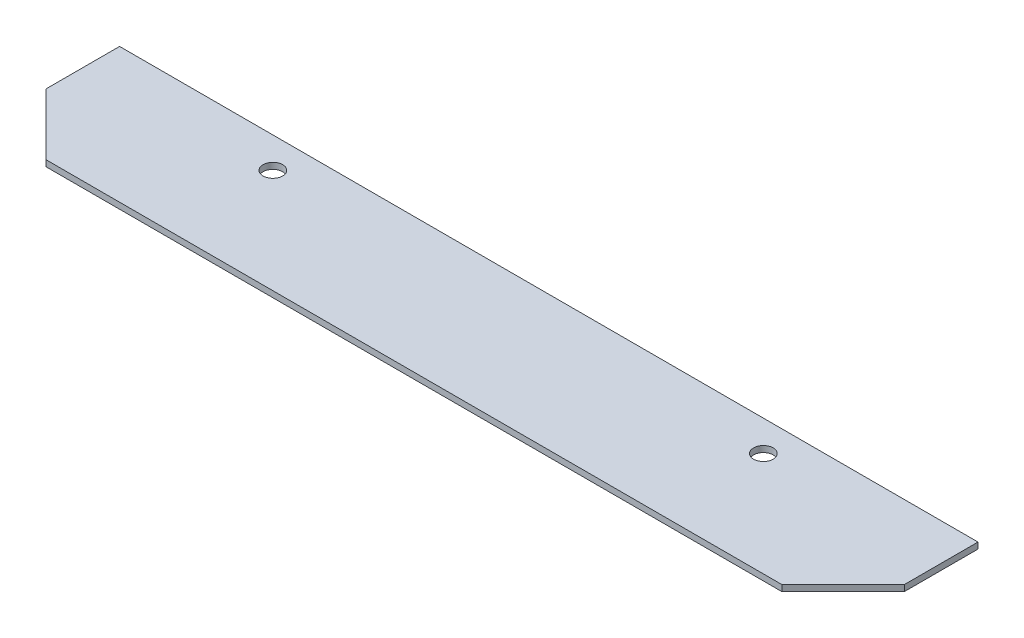
ISO-10303-21;
HEADER;
FILE_DESCRIPTION(('STEP AP214'),'2;1');
FILE_NAME('part.step','',(''),(''),'','','');
FILE_SCHEMA(('AUTOMOTIVE_DESIGN { 1 0 10303 214 1 1 1 1 }'));
ENDSEC;
DATA;
#1=APPLICATION_CONTEXT('core data for automotive mechanical design processes');
#2=APPLICATION_PROTOCOL_DEFINITION('international standard','automotive_design',2000,#1);
#3=PRODUCT_CONTEXT('',#1,'mechanical');
#4=PRODUCT('Part','Part','',(#3));
#5=PRODUCT_RELATED_PRODUCT_CATEGORY('part','',(#4));
#6=PRODUCT_DEFINITION_FORMATION('','',#4);
#7=PRODUCT_DEFINITION_CONTEXT('part definition',#1,'design');
#8=PRODUCT_DEFINITION('design','',#6,#7);
#9=PRODUCT_DEFINITION_SHAPE('','',#8);
#10=(LENGTH_UNIT() NAMED_UNIT(*) SI_UNIT(.MILLI.,.METRE.));
#11=(NAMED_UNIT(*) PLANE_ANGLE_UNIT() SI_UNIT($,.RADIAN.));
#12=(NAMED_UNIT(*) SI_UNIT($,.STERADIAN.) SOLID_ANGLE_UNIT());
#13=UNCERTAINTY_MEASURE_WITH_UNIT(LENGTH_MEASURE(1.E-05),#10,'distance_accuracy_value','');
#14=(GEOMETRIC_REPRESENTATION_CONTEXT(3) GLOBAL_UNCERTAINTY_ASSIGNED_CONTEXT((#13)) GLOBAL_UNIT_ASSIGNED_CONTEXT((#10,
#11,#12)) REPRESENTATION_CONTEXT('',''));
#15=CARTESIAN_POINT('',(0.,0.,0.));
#16=DIRECTION('',(0.,0.,1.));
#17=DIRECTION('',(1.,0.,0.));
#18=AXIS2_PLACEMENT_3D('',#15,#16,#17);
#19=CARTESIAN_POINT('',(70.,1.,-11.));
#20=DIRECTION('',(-1.,0.,0.));
#21=DIRECTION('',(0.,0.,1.));
#22=AXIS2_PLACEMENT_3D('',#19,#20,#21);
#23=PLANE('',#22);
#24=DIRECTION('',(0.,0.,-1.));
#25=VECTOR('',#24,1.);
#26=CARTESIAN_POINT('',(70.,1.,-11.));
#27=LINE('',#26,#25);
#28=CARTESIAN_POINT('',(70.,1.,1.00000000000002));
#29=VERTEX_POINT('',#28);
#30=CARTESIAN_POINT('',(70.,1.,-11.));
#31=VERTEX_POINT('',#30);
#32=EDGE_CURVE('E100',#29,#31,#27,.T.);
#33=ORIENTED_EDGE('',*,*,#32,.F.);
#34=DIRECTION('',(0.,-1.,0.));
#35=VECTOR('',#34,1.);
#36=CARTESIAN_POINT('',(70.,1.,1.00000000000002));
#37=LINE('',#36,#35);
#38=CARTESIAN_POINT('',(70.,0.,1.00000000000002));
#39=VERTEX_POINT('',#38);
#40=EDGE_CURVE('E11',#29,#39,#37,.T.);
#41=ORIENTED_EDGE('',*,*,#40,.T.);
#42=DIRECTION('',(0.,0.,-1.));
#43=VECTOR('',#42,1.);
#44=CARTESIAN_POINT('',(70.,0.,-11.));
#45=LINE('',#44,#43);
#46=CARTESIAN_POINT('',(70.,0.,-11.));
#47=VERTEX_POINT('',#46);
#48=EDGE_CURVE('E118',#39,#47,#45,.T.);
#49=ORIENTED_EDGE('',*,*,#48,.T.);
#50=DIRECTION('',(0.,-1.,0.));
#51=VECTOR('',#50,1.);
#52=CARTESIAN_POINT('',(70.,1.,-11.));
#53=LINE('',#52,#51);
#54=EDGE_CURVE('E109',#31,#47,#53,.T.);
#55=ORIENTED_EDGE('',*,*,#54,.F.);
#56=EDGE_LOOP('',(#33,#41,#49,#55));
#57=FACE_BOUND('',#56,.T.);
#58=ADVANCED_FACE('F43',(#57),#23,.F.);
#59=CARTESIAN_POINT('',(-70.,1.,-11.));
#60=DIRECTION('',(0.,0.,1.));
#61=DIRECTION('',(1.,0.,0.));
#62=AXIS2_PLACEMENT_3D('',#59,#60,#61);
#63=PLANE('',#62);
#64=DIRECTION('',(-1.,0.,0.));
#65=VECTOR('',#64,1.);
#66=CARTESIAN_POINT('',(-70.,0.,-11.));
#67=LINE('',#66,#65);
#68=CARTESIAN_POINT('',(-70.,0.,-11.));
#69=VERTEX_POINT('',#68);
#70=EDGE_CURVE('E149',#47,#69,#67,.T.);
#71=ORIENTED_EDGE('',*,*,#70,.T.);
#72=DIRECTION('',(0.,-1.,0.));
#73=VECTOR('',#72,1.);
#74=CARTESIAN_POINT('',(-70.,1.,-11.));
#75=LINE('',#74,#73);
#76=CARTESIAN_POINT('',(-70.,1.,-11.));
#77=VERTEX_POINT('',#76);
#78=EDGE_CURVE('E115',#77,#69,#75,.T.);
#79=ORIENTED_EDGE('',*,*,#78,.F.);
#80=DIRECTION('',(-1.,0.,0.));
#81=VECTOR('',#80,1.);
#82=CARTESIAN_POINT('',(-70.,1.,-11.));
#83=LINE('',#82,#81);
#84=EDGE_CURVE('E99',#31,#77,#83,.T.);
#85=ORIENTED_EDGE('',*,*,#84,.F.);
#86=ORIENTED_EDGE('',*,*,#54,.T.);
#87=EDGE_LOOP('',(#71,#79,#85,#86));
#88=FACE_BOUND('',#87,.T.);
#89=ADVANCED_FACE('F108',(#88),#63,.F.);
#90=CARTESIAN_POINT('',(-70.,1.,-11.));
#91=DIRECTION('',(1.,0.,0.));
#92=DIRECTION('',(0.,0.,-1.));
#93=AXIS2_PLACEMENT_3D('',#90,#91,#92);
#94=PLANE('',#93);
#95=DIRECTION('',(0.,0.,1.));
#96=VECTOR('',#95,1.);
#97=CARTESIAN_POINT('',(-70.,0.,-11.));
#98=LINE('',#97,#96);
#99=CARTESIAN_POINT('',(-70.,0.,0.999999999999949));
#100=VERTEX_POINT('',#99);
#101=EDGE_CURVE('E150',#69,#100,#98,.T.);
#102=ORIENTED_EDGE('',*,*,#101,.T.);
#103=DIRECTION('',(0.,1.,0.));
#104=VECTOR('',#103,1.);
#105=CARTESIAN_POINT('',(-70.,1.,0.999999999999949));
#106=LINE('',#105,#104);
#107=CARTESIAN_POINT('',(-70.,1.,0.999999999999949));
#108=VERTEX_POINT('',#107);
#109=EDGE_CURVE('E70',#100,#108,#106,.T.);
#110=ORIENTED_EDGE('',*,*,#109,.T.);
#111=DIRECTION('',(0.,0.,1.));
#112=VECTOR('',#111,1.);
#113=CARTESIAN_POINT('',(-70.,1.,-11.));
#114=LINE('',#113,#112);
#115=EDGE_CURVE('E114',#77,#108,#114,.T.);
#116=ORIENTED_EDGE('',*,*,#115,.F.);
#117=ORIENTED_EDGE('',*,*,#78,.T.);
#118=EDGE_LOOP('',(#102,#110,#116,#117));
#119=FACE_BOUND('',#118,.T.);
#120=ADVANCED_FACE('F146',(#119),#94,.F.);
#121=CARTESIAN_POINT('',(-70.,1.,11.));
#122=DIRECTION('',(0.,0.,-1.));
#123=DIRECTION('',(-1.,0.,0.));
#124=AXIS2_PLACEMENT_3D('',#121,#122,#123);
#125=PLANE('',#124);
#126=DIRECTION('',(1.,0.,0.));
#127=VECTOR('',#126,1.);
#128=CARTESIAN_POINT('',(-70.,1.,11.));
#129=LINE('',#128,#127);
#130=CARTESIAN_POINT('',(-60.,1.,11.));
#131=VERTEX_POINT('',#130);
#132=CARTESIAN_POINT('',(60.,1.,11.));
#133=VERTEX_POINT('',#132);
#134=EDGE_CURVE('E125',#131,#133,#129,.T.);
#135=ORIENTED_EDGE('',*,*,#134,.F.);
#136=DIRECTION('',(0.,-1.,0.));
#137=VECTOR('',#136,1.);
#138=CARTESIAN_POINT('',(-60.,1.,11.));
#139=LINE('',#138,#137);
#140=CARTESIAN_POINT('',(-60.,0.,11.));
#141=VERTEX_POINT('',#140);
#142=EDGE_CURVE('E117',#131,#141,#139,.T.);
#143=ORIENTED_EDGE('',*,*,#142,.T.);
#144=DIRECTION('',(1.,0.,0.));
#145=VECTOR('',#144,1.);
#146=CARTESIAN_POINT('',(-70.,0.,11.));
#147=LINE('',#146,#145);
#148=CARTESIAN_POINT('',(60.,0.,11.));
#149=VERTEX_POINT('',#148);
#150=EDGE_CURVE('E104',#141,#149,#147,.T.);
#151=ORIENTED_EDGE('',*,*,#150,.T.);
#152=DIRECTION('',(0.,1.,0.));
#153=VECTOR('',#152,1.);
#154=CARTESIAN_POINT('',(60.,1.,11.));
#155=LINE('',#154,#153);
#156=EDGE_CURVE('E116',#149,#133,#155,.T.);
#157=ORIENTED_EDGE('',*,*,#156,.T.);
#158=EDGE_LOOP('',(#135,#143,#151,#157));
#159=FACE_BOUND('',#158,.T.);
#160=ADVANCED_FACE('F139',(#159),#125,.F.);
#161=CARTESIAN_POINT('',(0.,1.,0.));
#162=DIRECTION('',(0.,1.,0.));
#163=DIRECTION('',(0.,0.,1.));
#164=AXIS2_PLACEMENT_3D('',#161,#162,#163);
#165=PLANE('',#164);
#166=CARTESIAN_POINT('',(40.,0.999999999999999,-5.99999999999999));
#167=DIRECTION('',(0.,1.,0.));
#168=DIRECTION('',(0.,0.,1.));
#169=AXIS2_PLACEMENT_3D('',#166,#167,#168);
#170=CIRCLE('',#169,1.6);
#171=CARTESIAN_POINT('',(40.,0.999999999999999,-4.4));
#172=VERTEX_POINT('',#171);
#173=EDGE_CURVE('E153',#172,#172,#170,.T.);
#174=ORIENTED_EDGE('',*,*,#173,.F.);
#175=EDGE_LOOP('',(#174));
#176=FACE_BOUND('',#175,.T.);
#177=CARTESIAN_POINT('',(-40.,0.999999999999999,-5.99999999999999));
#178=DIRECTION('',(0.,1.,0.));
#179=DIRECTION('',(0.,0.,1.));
#180=AXIS2_PLACEMENT_3D('',#177,#178,#179);
#181=CIRCLE('',#180,1.6);
#182=CARTESIAN_POINT('',(-40.,0.999999999999999,-4.4));
#183=VERTEX_POINT('',#182);
#184=EDGE_CURVE('E158',#183,#183,#181,.T.);
#185=ORIENTED_EDGE('',*,*,#184,.F.);
#186=EDGE_LOOP('',(#185));
#187=FACE_BOUND('',#186,.T.);
#188=ORIENTED_EDGE('',*,*,#115,.T.);
#189=DIRECTION('',(-0.707106781186546,0.,-0.70710678118655));
#190=VECTOR('',#189,1.);
#191=CARTESIAN_POINT('',(-35.5000000000002,1.,35.5));
#192=LINE('',#191,#190);
#193=EDGE_CURVE('E55',#108,#131,#192,.F.);
#194=ORIENTED_EDGE('',*,*,#193,.T.);
#195=ORIENTED_EDGE('',*,*,#134,.T.);
#196=DIRECTION('',(-0.707106781186549,0.,0.707106781186547));
#197=VECTOR('',#196,1.);
#198=CARTESIAN_POINT('',(35.4999999999999,1.,35.5));
#199=LINE('',#198,#197);
#200=EDGE_CURVE('E56',#133,#29,#199,.F.);
#201=ORIENTED_EDGE('',*,*,#200,.T.);
#202=ORIENTED_EDGE('',*,*,#32,.T.);
#203=ORIENTED_EDGE('',*,*,#84,.T.);
#204=EDGE_LOOP('',(#188,#194,#195,#201,#202,#203));
#205=FACE_BOUND('',#204,.T.);
#206=ADVANCED_FACE('F97',(#176,#187,#205),#165,.T.);
#207=CARTESIAN_POINT('',(0.,0.,0.));
#208=DIRECTION('',(0.,1.,0.));
#209=DIRECTION('',(0.,0.,1.));
#210=AXIS2_PLACEMENT_3D('',#207,#208,#209);
#211=PLANE('',#210);
#212=CARTESIAN_POINT('',(40.,0.,-5.99999999999999));
#213=DIRECTION('',(0.,-1.,0.));
#214=DIRECTION('',(0.,0.,-1.));
#215=AXIS2_PLACEMENT_3D('',#212,#213,#214);
#216=CIRCLE('',#215,1.6);
#217=CARTESIAN_POINT('',(40.,0.,-7.59999999999999));
#218=VERTEX_POINT('',#217);
#219=EDGE_CURVE('E161',#218,#218,#216,.T.);
#220=ORIENTED_EDGE('',*,*,#219,.F.);
#221=EDGE_LOOP('',(#220));
#222=FACE_BOUND('',#221,.T.);
#223=CARTESIAN_POINT('',(-40.,0.,-5.99999999999999));
#224=DIRECTION('',(0.,-1.,0.));
#225=DIRECTION('',(0.,0.,-1.));
#226=AXIS2_PLACEMENT_3D('',#223,#224,#225);
#227=CIRCLE('',#226,1.6);
#228=CARTESIAN_POINT('',(-40.,0.,-7.59999999999999));
#229=VERTEX_POINT('',#228);
#230=EDGE_CURVE('E165',#229,#229,#227,.T.);
#231=ORIENTED_EDGE('',*,*,#230,.F.);
#232=EDGE_LOOP('',(#231));
#233=FACE_BOUND('',#232,.T.);
#234=ORIENTED_EDGE('',*,*,#150,.F.);
#235=DIRECTION('',(0.707106781186546,0.,0.70710678118655));
#236=VECTOR('',#235,1.);
#237=CARTESIAN_POINT('',(-60.,0.,11.));
#238=LINE('',#237,#236);
#239=EDGE_CURVE('E128',#141,#100,#238,.F.);
#240=ORIENTED_EDGE('',*,*,#239,.T.);
#241=ORIENTED_EDGE('',*,*,#101,.F.);
#242=ORIENTED_EDGE('',*,*,#70,.F.);
#243=ORIENTED_EDGE('',*,*,#48,.F.);
#244=DIRECTION('',(0.707106781186549,0.,-0.707106781186547));
#245=VECTOR('',#244,1.);
#246=CARTESIAN_POINT('',(70.,0.,1.00000000000002));
#247=LINE('',#246,#245);
#248=EDGE_CURVE('E126',#39,#149,#247,.F.);
#249=ORIENTED_EDGE('',*,*,#248,.T.);
#250=EDGE_LOOP('',(#234,#240,#241,#242,#243,#249));
#251=FACE_BOUND('',#250,.T.);
#252=ADVANCED_FACE('F148',(#222,#233,#251),#211,.F.);
#253=CARTESIAN_POINT('',(-40.,10.,-5.99999999999999));
#254=DIRECTION('',(0.,-1.,0.));
#255=DIRECTION('',(0.,0.,-1.));
#256=AXIS2_PLACEMENT_3D('',#253,#254,#255);
#257=CYLINDRICAL_SURFACE('',#256,1.6);
#258=ORIENTED_EDGE('',*,*,#184,.T.);
#259=EDGE_LOOP('',(#258));
#260=FACE_BOUND('',#259,.T.);
#261=ORIENTED_EDGE('',*,*,#230,.T.);
#262=EDGE_LOOP('',(#261));
#263=FACE_BOUND('',#262,.T.);
#264=ADVANCED_FACE('F175',(#260,#263),#257,.F.);
#265=CARTESIAN_POINT('',(40.,10.,-5.99999999999999));
#266=DIRECTION('',(0.,-1.,0.));
#267=DIRECTION('',(0.,0.,-1.));
#268=AXIS2_PLACEMENT_3D('',#265,#266,#267);
#269=CYLINDRICAL_SURFACE('',#268,1.6);
#270=ORIENTED_EDGE('',*,*,#173,.T.);
#271=EDGE_LOOP('',(#270));
#272=FACE_BOUND('',#271,.T.);
#273=ORIENTED_EDGE('',*,*,#219,.T.);
#274=EDGE_LOOP('',(#273));
#275=FACE_BOUND('',#274,.T.);
#276=ADVANCED_FACE('F169',(#272,#275),#269,.F.);
#277=CARTESIAN_POINT('',(-60.,1.,11.));
#278=DIRECTION('',(0.70710678118655,0.,-0.707106781186546));
#279=DIRECTION('',(0.,-1.,0.));
#280=AXIS2_PLACEMENT_3D('',#277,#278,#279);
#281=PLANE('',#280);
#282=ORIENTED_EDGE('',*,*,#193,.F.);
#283=ORIENTED_EDGE('',*,*,#109,.F.);
#284=ORIENTED_EDGE('',*,*,#239,.F.);
#285=ORIENTED_EDGE('',*,*,#142,.F.);
#286=EDGE_LOOP('',(#282,#283,#284,#285));
#287=FACE_BOUND('',#286,.T.);
#288=ADVANCED_FACE('F141',(#287),#281,.F.);
#289=CARTESIAN_POINT('',(70.,1.,1.00000000000002));
#290=DIRECTION('',(-0.707106781186546,0.,-0.707106781186548));
#291=DIRECTION('',(0.,-1.,0.));
#292=AXIS2_PLACEMENT_3D('',#289,#290,#291);
#293=PLANE('',#292);
#294=ORIENTED_EDGE('',*,*,#200,.F.);
#295=ORIENTED_EDGE('',*,*,#156,.F.);
#296=ORIENTED_EDGE('',*,*,#248,.F.);
#297=ORIENTED_EDGE('',*,*,#40,.F.);
#298=EDGE_LOOP('',(#294,#295,#296,#297));
#299=FACE_BOUND('',#298,.T.);
#300=ADVANCED_FACE('F46',(#299),#293,.F.);
#301=CLOSED_SHELL('',(#58,#89,#120,#160,#206,#252,#264,#276,#288,#300));
#302=MANIFOLD_SOLID_BREP('B2',#301);
#303=ADVANCED_BREP_SHAPE_REPRESENTATION('',(#18,#302),#14);
#304=SHAPE_DEFINITION_REPRESENTATION(#9,#303);
ENDSEC;
END-ISO-10303-21;
